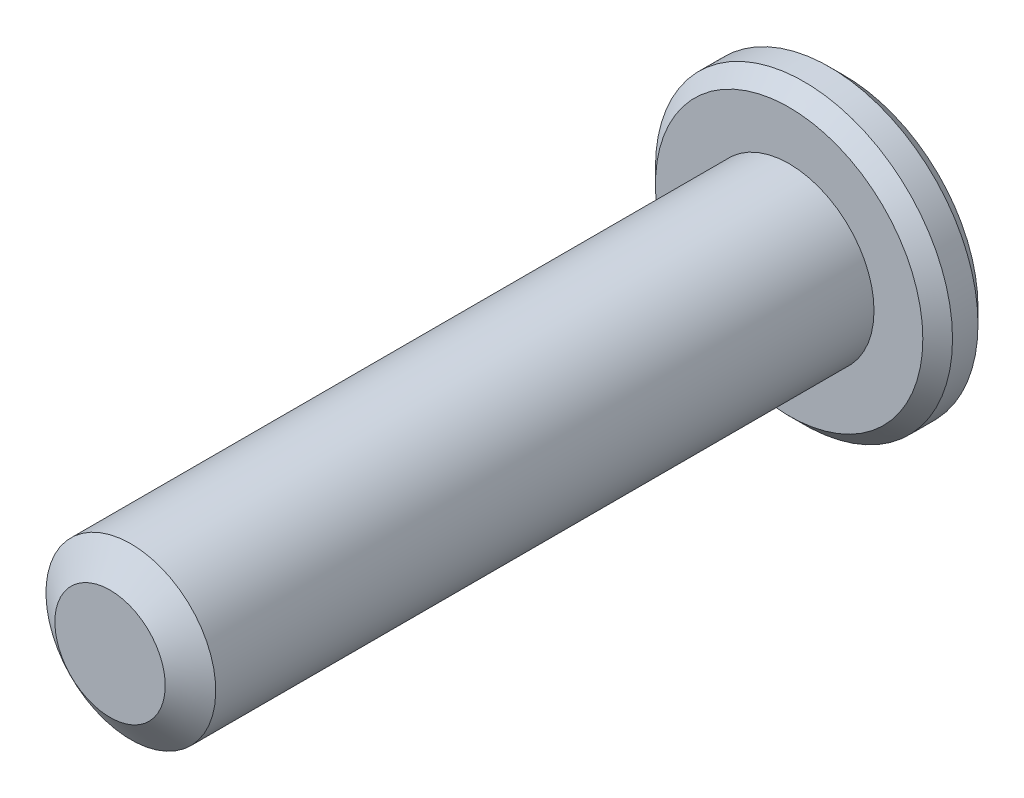
ISO-10303-21;
HEADER;
FILE_DESCRIPTION(('STEP AP214'),'2;1');
FILE_NAME('part.step','',(''),(''),'','','');
FILE_SCHEMA(('AUTOMOTIVE_DESIGN { 1 0 10303 214 1 1 1 1 }'));
ENDSEC;
DATA;
#1=APPLICATION_CONTEXT('core data for automotive mechanical design processes');
#2=APPLICATION_PROTOCOL_DEFINITION('international standard','automotive_design',2000,#1);
#3=PRODUCT_CONTEXT('',#1,'mechanical');
#4=PRODUCT('Part','Part','',(#3));
#5=PRODUCT_RELATED_PRODUCT_CATEGORY('part','',(#4));
#6=PRODUCT_DEFINITION_FORMATION('','',#4);
#7=PRODUCT_DEFINITION_CONTEXT('part definition',#1,'design');
#8=PRODUCT_DEFINITION('design','',#6,#7);
#9=PRODUCT_DEFINITION_SHAPE('','',#8);
#10=(LENGTH_UNIT() NAMED_UNIT(*) SI_UNIT(.MILLI.,.METRE.));
#11=(NAMED_UNIT(*) PLANE_ANGLE_UNIT() SI_UNIT($,.RADIAN.));
#12=(NAMED_UNIT(*) SI_UNIT($,.STERADIAN.) SOLID_ANGLE_UNIT());
#13=UNCERTAINTY_MEASURE_WITH_UNIT(LENGTH_MEASURE(1.E-05),#10,'distance_accuracy_value','');
#14=(GEOMETRIC_REPRESENTATION_CONTEXT(3) GLOBAL_UNCERTAINTY_ASSIGNED_CONTEXT((#13)) GLOBAL_UNIT_ASSIGNED_CONTEXT((#10,
#11,#12)) REPRESENTATION_CONTEXT('',''));
#15=CARTESIAN_POINT('',(0.,0.,0.));
#16=DIRECTION('',(0.,0.,1.));
#17=DIRECTION('',(1.,0.,0.));
#18=AXIS2_PLACEMENT_3D('',#15,#16,#17);
#19=CARTESIAN_POINT('',(0.,0.,0.));
#20=DIRECTION('',(0.,0.,1.));
#21=DIRECTION('',(1.,0.,0.));
#22=AXIS2_PLACEMENT_3D('',#19,#20,#21);
#23=PLANE('',#22);
#24=CARTESIAN_POINT('',(0.,0.,0.));
#25=DIRECTION('',(0.,0.,1.));
#26=DIRECTION('',(1.,0.,0.));
#27=AXIS2_PLACEMENT_3D('',#24,#25,#26);
#28=CIRCLE('',#27,3.15);
#29=CARTESIAN_POINT('',(3.15,0.,0.));
#30=VERTEX_POINT('',#29);
#31=EDGE_CURVE('E11',#30,#30,#28,.F.);
#32=ORIENTED_EDGE('',*,*,#31,.T.);
#33=EDGE_LOOP('',(#32));
#34=FACE_BOUND('',#33,.T.);
#35=CARTESIAN_POINT('',(0.,0.,0.));
#36=DIRECTION('',(0.,0.,1.));
#37=DIRECTION('',(1.,0.,0.));
#38=AXIS2_PLACEMENT_3D('',#35,#36,#37);
#39=CIRCLE('',#38,1.44337567297406);
#40=CARTESIAN_POINT('',(1.25,0.721687836487034,0.));
#41=VERTEX_POINT('',#40);
#42=CARTESIAN_POINT('',(0.,1.44337567297406,0.));
#43=VERTEX_POINT('',#42);
#44=EDGE_CURVE('E92',#41,#43,#39,.T.);
#45=ORIENTED_EDGE('',*,*,#44,.T.);
#46=CARTESIAN_POINT('',(0.,0.,0.));
#47=DIRECTION('',(0.,0.,1.));
#48=DIRECTION('',(1.,0.,0.));
#49=AXIS2_PLACEMENT_3D('',#46,#47,#48);
#50=CIRCLE('',#49,1.44337567297406);
#51=CARTESIAN_POINT('',(-1.25,0.721687836487029,0.));
#52=VERTEX_POINT('',#51);
#53=EDGE_CURVE('E103',#43,#52,#50,.T.);
#54=ORIENTED_EDGE('',*,*,#53,.T.);
#55=CARTESIAN_POINT('',(0.,0.,0.));
#56=DIRECTION('',(0.,0.,1.));
#57=DIRECTION('',(1.,0.,0.));
#58=AXIS2_PLACEMENT_3D('',#55,#56,#57);
#59=CIRCLE('',#58,1.44337567297406);
#60=CARTESIAN_POINT('',(-1.25,-0.721687836487031,0.));
#61=VERTEX_POINT('',#60);
#62=EDGE_CURVE('E121',#52,#61,#59,.T.);
#63=ORIENTED_EDGE('',*,*,#62,.T.);
#64=CARTESIAN_POINT('',(0.,0.,0.));
#65=DIRECTION('',(0.,0.,1.));
#66=DIRECTION('',(1.,0.,0.));
#67=AXIS2_PLACEMENT_3D('',#64,#65,#66);
#68=CIRCLE('',#67,1.44337567297406);
#69=CARTESIAN_POINT('',(0.,-1.44337567297406,0.));
#70=VERTEX_POINT('',#69);
#71=EDGE_CURVE('E256',#61,#70,#68,.T.);
#72=ORIENTED_EDGE('',*,*,#71,.T.);
#73=CARTESIAN_POINT('',(0.,0.,0.));
#74=DIRECTION('',(0.,0.,1.));
#75=DIRECTION('',(1.,0.,0.));
#76=AXIS2_PLACEMENT_3D('',#73,#74,#75);
#77=CIRCLE('',#76,1.44337567297406);
#78=CARTESIAN_POINT('',(1.25,-0.721687836487033,0.));
#79=VERTEX_POINT('',#78);
#80=EDGE_CURVE('E257',#70,#79,#77,.T.);
#81=ORIENTED_EDGE('',*,*,#80,.T.);
#82=CARTESIAN_POINT('',(0.,0.,0.));
#83=DIRECTION('',(0.,0.,1.));
#84=DIRECTION('',(1.,0.,0.));
#85=AXIS2_PLACEMENT_3D('',#82,#83,#84);
#86=CIRCLE('',#85,1.44337567297406);
#87=EDGE_CURVE('E106',#79,#41,#86,.T.);
#88=ORIENTED_EDGE('',*,*,#87,.T.);
#89=EDGE_LOOP('',(#45,#54,#63,#72,#81,#88));
#90=FACE_BOUND('',#89,.T.);
#91=ADVANCED_FACE('F34',(#34,#90),#23,.F.);
#92=CARTESIAN_POINT('',(1.25,0.721687836487033,0.975));
#93=DIRECTION('',(-0.5,-0.866025403784439,0.));
#94=DIRECTION('',(0.866025403784439,-0.5,0.));
#95=AXIS2_PLACEMENT_3D('',#92,#93,#94);
#96=PLANE('',#95);
#97=DIRECTION('',(0.,0.,-1.));
#98=VECTOR('',#97,1.);
#99=CARTESIAN_POINT('',(0.,1.44337567297406,0.975));
#100=LINE('',#99,#98);
#101=CARTESIAN_POINT('',(0.,1.44337567297406,0.975));
#102=VERTEX_POINT('',#101);
#103=EDGE_CURVE('E118',#102,#43,#100,.T.);
#104=ORIENTED_EDGE('',*,*,#103,.T.);
#105=CARTESIAN_POINT('',(1.2502,0.721572366433195,-0.000115483909135154));
#106=CARTESIAN_POINT('',(1.20722483292841,0.746384090710445,0.0246783319448971));
#107=CARTESIAN_POINT('',(1.16353099525405,0.771610739653665,0.0480162655813172));
#108=CARTESIAN_POINT('',(1.07443406915806,0.823050873919155,0.0907479959154641));
#109=CARTESIAN_POINT('',(1.02902250164293,0.849269254648334,0.110118007639587));
#110=CARTESIAN_POINT('',(0.937452179064738,0.902137405038636,0.143299516586524));
#111=CARTESIAN_POINT('',(0.891316759824113,0.928773701756387,0.157194440947345));
#112=CARTESIAN_POINT('',(0.798029919592406,0.982632884076013,0.178602717839362));
#113=CARTESIAN_POINT('',(0.750881350863619,1.00985412292348,0.186132058433214));
#114=CARTESIAN_POINT('',(0.669626443112746,1.05676666578643,0.192925501949298));
#115=CARTESIAN_POINT('',(0.635625123372058,1.07639733689152,0.193931440895651));
#116=CARTESIAN_POINT('',(0.567682235567521,1.11562418145499,0.192238585088682));
#117=CARTESIAN_POINT('',(0.533740682344341,1.1352203463451,0.189538972784462));
#118=CARTESIAN_POINT('',(0.466185143542499,1.1742235548576,0.180591069683623));
#119=CARTESIAN_POINT('',(0.432571492713224,1.19363040521233,0.174339474100295));
#120=CARTESIAN_POINT('',(0.365905361782186,1.23212011385119,0.158624318586096));
#121=CARTESIAN_POINT('',(0.332853128969703,1.2512028293628,0.149159379912542));
#122=CARTESIAN_POINT('',(0.248200308399734,1.30007715810653,0.121068609312414));
#123=CARTESIAN_POINT('',(0.19713350757036,1.32956058931202,0.1003298425478));
#124=CARTESIAN_POINT('',(0.0969991458867435,1.38737318998519,0.053612865328524));
#125=CARTESIAN_POINT('',(0.0479256884217289,1.41570576386268,0.0276517040532343));
#126=CARTESIAN_POINT('',(-0.000200000000001579,1.4434911430279,-0.000115483909135786));
#127=B_SPLINE_CURVE_WITH_KNOTS('',3,(#105,#106,#107,#108,#109,#110,#111,#112,#113,#114,#115,
#116,#117,#118,#119,#120,#121,#122,#123,#124,#125,#126),.UNSPECIFIED.,.F.,.F.,(4,2,2,2,2,2,2,2,
2,2,4),(0.,0.166533409618303,0.334037607289761,0.498880396489697,0.663307919240274,
0.780963963458826,0.898645970148452,1.01643764860773,1.13427993171549,1.32148652032141,
1.50809158792573),.UNSPECIFIED.);
#128=EDGE_CURVE('E89',#41,#43,#127,.T.);
#129=ORIENTED_EDGE('',*,*,#128,.F.);
#130=DIRECTION('',(0.,0.,-1.));
#131=VECTOR('',#130,1.);
#132=CARTESIAN_POINT('',(1.25,0.721687836487033,0.975));
#133=LINE('',#132,#131);
#134=CARTESIAN_POINT('',(1.25,0.721687836487033,0.975));
#135=VERTEX_POINT('',#134);
#136=EDGE_CURVE('E238',#135,#41,#133,.T.);
#137=ORIENTED_EDGE('',*,*,#136,.F.);
#138=DIRECTION('',(-0.866025403784439,0.499999999999999,0.));
#139=VECTOR('',#138,1.);
#140=CARTESIAN_POINT('',(1.25,0.721687836487033,0.975));
#141=LINE('',#140,#139);
#142=EDGE_CURVE('E113',#135,#102,#141,.T.);
#143=ORIENTED_EDGE('',*,*,#142,.T.);
#144=EDGE_LOOP('',(#104,#129,#137,#143));
#145=FACE_BOUND('',#144,.T.);
#146=ADVANCED_FACE('F124',(#145),#96,.T.);
#147=CARTESIAN_POINT('',(1.25,-0.72168783648703,0.975));
#148=DIRECTION('',(-1.,0.,0.));
#149=DIRECTION('',(0.,-1.,0.));
#150=AXIS2_PLACEMENT_3D('',#147,#148,#149);
#151=PLANE('',#150);
#152=ORIENTED_EDGE('',*,*,#136,.T.);
#153=CARTESIAN_POINT('',(1.25,-1.38992943348888,-0.425956782764809));
#154=CARTESIAN_POINT('',(1.25,-1.35585360144598,-0.400623845905462));
#155=CARTESIAN_POINT('',(1.25,-1.32158265708561,-0.375554038623504));
#156=CARTESIAN_POINT('',(1.25,-1.25257320054392,-0.326047772105517));
#157=CARTESIAN_POINT('',(1.25,-1.21783456799035,-0.301611480846757));
#158=CARTESIAN_POINT('',(1.25,-1.11229379200971,-0.229066172613867));
#159=CARTESIAN_POINT('',(1.25,-1.04068485708168,-0.182111039259463));
#160=CARTESIAN_POINT('',(1.25,-0.890834011639573,-0.090370816664351));
#161=CARTESIAN_POINT('',(1.25,-0.812441254075326,-0.0458291712301425));
#162=CARTESIAN_POINT('',(1.25,-0.651805951733887,0.0353370411272767));
#163=CARTESIAN_POINT('',(1.25,-0.569577514603351,0.071988205932038));
#164=CARTESIAN_POINT('',(1.25,-0.445666902783947,0.116811215274388));
#165=CARTESIAN_POINT('',(1.25,-0.405715906756983,0.129754356856506));
#166=CARTESIAN_POINT('',(1.25,-0.324892689132276,0.152426214590396));
#167=CARTESIAN_POINT('',(1.25,-0.284020400151318,0.162154694802131));
#168=CARTESIAN_POINT('',(1.25,-0.202258662465061,0.177742360186229));
#169=CARTESIAN_POINT('',(1.25,-0.161381483064384,0.183664926568388));
#170=CARTESIAN_POINT('',(1.25,-0.0792441307238302,0.191532978674059));
#171=CARTESIAN_POINT('',(1.25,-0.0379840154943749,0.193479054203921));
#172=CARTESIAN_POINT('',(1.25,0.043234160036465,0.193267103507984));
#173=CARTESIAN_POINT('',(1.25,0.0831926097530767,0.191235450956019));
#174=CARTESIAN_POINT('',(1.25,0.16274644611995,0.183447818944177));
#175=CARTESIAN_POINT('',(1.25,0.202341758544679,0.177691094556945));
#176=CARTESIAN_POINT('',(1.25,0.28154631912982,0.162661385825963));
#177=CARTESIAN_POINT('',(1.25,0.321144394728612,0.153330372505309));
#178=CARTESIAN_POINT('',(1.25,0.399480919290786,0.131632964761722));
#179=CARTESIAN_POINT('',(1.25,0.438219456017128,0.119266881803288));
#180=CARTESIAN_POINT('',(1.25,0.562551887219006,0.0749889167188917));
#181=CARTESIAN_POINT('',(1.25,0.646311872820088,0.0379381891982371));
#182=CARTESIAN_POINT('',(1.25,0.809873231963308,-0.0443641458390639));
#183=CARTESIAN_POINT('',(1.25,0.889658742138622,-0.089645710239019));
#184=CARTESIAN_POINT('',(1.25,1.04210036236046,-0.182982930104089));
#185=CARTESIAN_POINT('',(1.25,1.11491334005909,-0.230785501963126));
#186=CARTESIAN_POINT('',(1.25,1.22219009712169,-0.304648670049724));
#187=CARTESIAN_POINT('',(1.25,1.25748474843868,-0.329523500309345));
#188=CARTESIAN_POINT('',(1.25,1.32759376690005,-0.379921884715908));
#189=CARTESIAN_POINT('',(1.25,1.36240826213734,-0.405445260473571));
#190=CARTESIAN_POINT('',(1.25,1.3970231565127,-0.431237273698583));
#191=B_SPLINE_CURVE_WITH_KNOTS('',3,(#153,#154,#155,#156,#157,#158,#159,#160,#161,#162,#163,
#164,#165,#166,#167,#168,#169,#170,#171,#172,#173,#174,#175,#176,#177,#178,#179,#180,#181,#182,
#183,#184,#185,#186,#187,#188,#189,#190),.UNSPECIFIED.,.F.,.F.,(4,2,2,2,2,2,2,2,2,2,2,2,2,2,2,2,
2,2,4),(0.,0.127379033817002,0.254791503830238,0.51156114040546,0.781814668857772,
1.05114242314895,1.17702064742504,1.30290810848099,1.42664072359054,1.55035498493452,
1.67020252454504,1.7900740382739,1.91198034452075,2.03387414574237,2.30782771694623,
2.58279909340042,2.84397769429347,2.97351138093346,3.10300981562539),.UNSPECIFIED.);
#192=EDGE_CURVE('E96',#79,#41,#191,.T.);
#193=ORIENTED_EDGE('',*,*,#192,.F.);
#194=DIRECTION('',(0.,0.,-1.));
#195=VECTOR('',#194,1.);
#196=CARTESIAN_POINT('',(1.25,-0.72168783648703,0.975));
#197=LINE('',#196,#195);
#198=CARTESIAN_POINT('',(1.25,-0.72168783648703,0.975));
#199=VERTEX_POINT('',#198);
#200=EDGE_CURVE('E240',#199,#79,#197,.T.);
#201=ORIENTED_EDGE('',*,*,#200,.F.);
#202=DIRECTION('',(0.,1.,0.));
#203=VECTOR('',#202,1.);
#204=CARTESIAN_POINT('',(1.25,-0.72168783648703,0.975));
#205=LINE('',#204,#203);
#206=EDGE_CURVE('E49',#199,#135,#205,.T.);
#207=ORIENTED_EDGE('',*,*,#206,.T.);
#208=EDGE_LOOP('',(#152,#193,#201,#207));
#209=FACE_BOUND('',#208,.T.);
#210=ADVANCED_FACE('F185',(#209),#151,.T.);
#211=CARTESIAN_POINT('',(0.,-1.44337567297406,0.975));
#212=DIRECTION('',(-0.5,0.866025403784438,0.));
#213=DIRECTION('',(-0.866025403784438,-0.5,0.));
#214=AXIS2_PLACEMENT_3D('',#211,#212,#213);
#215=PLANE('',#214);
#216=ORIENTED_EDGE('',*,*,#200,.T.);
#217=CARTESIAN_POINT('',(-0.00019999999999945,-1.4434911430279,-0.000115483909134157));
#218=CARTESIAN_POINT('',(0.0427751670715872,-1.41867941875065,0.0246783319448981));
#219=CARTESIAN_POINT('',(0.0864690047459484,-1.39345276980743,0.0480162655813181));
#220=CARTESIAN_POINT('',(0.175565930841942,-1.34201263554194,0.090747995915465));
#221=CARTESIAN_POINT('',(0.220977498357064,-1.31579425481276,0.110118007639588));
#222=CARTESIAN_POINT('',(0.31254782093526,-1.26292610442246,0.143299516586525));
#223=CARTESIAN_POINT('',(0.358683240175886,-1.23628980770471,0.157194440947346));
#224=CARTESIAN_POINT('',(0.451970080407592,-1.18243062538508,0.178602717839363));
#225=CARTESIAN_POINT('',(0.499118649136379,-1.15520938653761,0.186132058433215));
#226=CARTESIAN_POINT('',(0.580373556887252,-1.10829684367467,0.192925501949299));
#227=CARTESIAN_POINT('',(0.61437487662794,-1.08866617256958,0.193931440895652));
#228=CARTESIAN_POINT('',(0.682317764432476,-1.04943932800611,0.192238585088683));
#229=CARTESIAN_POINT('',(0.716259317655656,-1.02984316311599,0.189538972784463));
#230=CARTESIAN_POINT('',(0.783814856457498,-0.990839954603497,0.180591069683624));
#231=CARTESIAN_POINT('',(0.817428507286774,-0.971433104248769,0.174339474100296));
#232=CARTESIAN_POINT('',(0.884094638217812,-0.932943395609904,0.158624318586098));
#233=CARTESIAN_POINT('',(0.917146871030294,-0.913860680098299,0.149159379912544));
#234=CARTESIAN_POINT('',(1.00179969160026,-0.864986351354566,0.121068609312416));
#235=CARTESIAN_POINT('',(1.05286649242964,-0.835502920149074,0.100329842547801));
#236=CARTESIAN_POINT('',(1.15300085411325,-0.777690319475906,0.0536128653285254));
#237=CARTESIAN_POINT('',(1.20207431157827,-0.749357745598415,0.0276517040532356));
#238=CARTESIAN_POINT('',(1.2502,-0.721572366433192,-0.00011548390913426));
#239=B_SPLINE_CURVE_WITH_KNOTS('',3,(#217,#218,#219,#220,#221,#222,#223,#224,#225,#226,#227,
#228,#229,#230,#231,#232,#233,#234,#235,#236,#237,#238),.UNSPECIFIED.,.F.,.F.,(4,2,2,2,2,2,2,2,
2,2,4),(0.,0.166533409618303,0.334037607289761,0.498880396489697,0.663307919240273,
0.780963963458825,0.898645970148451,1.01643764860773,1.13427993171549,1.32148652032141,
1.50809158792573),.UNSPECIFIED.);
#240=EDGE_CURVE('E294',#70,#79,#239,.T.);
#241=ORIENTED_EDGE('',*,*,#240,.F.);
#242=DIRECTION('',(0.,0.,-1.));
#243=VECTOR('',#242,1.);
#244=CARTESIAN_POINT('',(0.,-1.44337567297406,0.975));
#245=LINE('',#244,#243);
#246=CARTESIAN_POINT('',(0.,-1.44337567297406,0.975));
#247=VERTEX_POINT('',#246);
#248=EDGE_CURVE('E242',#247,#70,#245,.T.);
#249=ORIENTED_EDGE('',*,*,#248,.F.);
#250=DIRECTION('',(0.866025403784438,0.5,0.));
#251=VECTOR('',#250,1.);
#252=CARTESIAN_POINT('',(0.,-1.44337567297406,0.975));
#253=LINE('',#252,#251);
#254=EDGE_CURVE('E57',#247,#199,#253,.T.);
#255=ORIENTED_EDGE('',*,*,#254,.T.);
#256=EDGE_LOOP('',(#216,#241,#249,#255));
#257=FACE_BOUND('',#256,.T.);
#258=ADVANCED_FACE('F210',(#257),#215,.T.);
#259=CARTESIAN_POINT('',(-1.25,-0.72168783648703,0.975));
#260=DIRECTION('',(0.499999999999999,0.866025403784439,0.));
#261=DIRECTION('',(-0.866025403784439,0.5,0.));
#262=AXIS2_PLACEMENT_3D('',#259,#260,#261);
#263=PLANE('',#262);
#264=ORIENTED_EDGE('',*,*,#248,.T.);
#265=CARTESIAN_POINT('',(-1.2502,-0.721572366433193,-0.000115483909136238));
#266=CARTESIAN_POINT('',(-1.20722483292841,-0.746384090710442,0.0246783319448964));
#267=CARTESIAN_POINT('',(-1.16353099525405,-0.771610739653662,0.0480162655813167));
#268=CARTESIAN_POINT('',(-1.07443406915806,-0.823050873919153,0.0907479959154638));
#269=CARTESIAN_POINT('',(-1.02902250164294,-0.849269254648332,0.110118007639587));
#270=CARTESIAN_POINT('',(-0.93745217906474,-0.902137405038634,0.143299516586524));
#271=CARTESIAN_POINT('',(-0.891316759824114,-0.928773701756385,0.157194440947345));
#272=CARTESIAN_POINT('',(-0.798029919592407,-0.982632884076011,0.178602717839362));
#273=CARTESIAN_POINT('',(-0.75088135086362,-1.00985412292348,0.186132058433214));
#274=CARTESIAN_POINT('',(-0.669626443112747,-1.05676666578643,0.192925501949298));
#275=CARTESIAN_POINT('',(-0.635625123372058,-1.07639733689152,0.193931440895651));
#276=CARTESIAN_POINT('',(-0.567682235567522,-1.11562418145499,0.192238585088683));
#277=CARTESIAN_POINT('',(-0.533740682344342,-1.1352203463451,0.189538972784463));
#278=CARTESIAN_POINT('',(-0.4661851435425,-1.1742235548576,0.180591069683624));
#279=CARTESIAN_POINT('',(-0.432571492713225,-1.19363040521232,0.174339474100296));
#280=CARTESIAN_POINT('',(-0.365905361782187,-1.23212011385119,0.158624318586097));
#281=CARTESIAN_POINT('',(-0.332853128969704,-1.25120282936279,0.149159379912543));
#282=CARTESIAN_POINT('',(-0.248200308399735,-1.30007715810653,0.121068609312416));
#283=CARTESIAN_POINT('',(-0.197133507570361,-1.32956058931202,0.100329842547801));
#284=CARTESIAN_POINT('',(-0.0969991458867447,-1.38737318998519,0.0536128653285252));
#285=CARTESIAN_POINT('',(-0.04792568842173,-1.41570576386268,0.0276517040532354));
#286=CARTESIAN_POINT('',(0.000200000000000551,-1.4434911430279,-0.000115483909134179));
#287=B_SPLINE_CURVE_WITH_KNOTS('',3,(#265,#266,#267,#268,#269,#270,#271,#272,#273,#274,#275,
#276,#277,#278,#279,#280,#281,#282,#283,#284,#285,#286),.UNSPECIFIED.,.F.,.F.,(4,2,2,2,2,2,2,2,
2,2,4),(0.,0.166533409618304,0.334037607289763,0.498880396489699,0.663307919240276,
0.780963963458828,0.898645970148454,1.01643764860773,1.1342799317155,1.32148652032141,
1.50809158792574),.UNSPECIFIED.);
#288=EDGE_CURVE('E253',#61,#70,#287,.T.);
#289=ORIENTED_EDGE('',*,*,#288,.F.);
#290=DIRECTION('',(0.,0.,-1.));
#291=VECTOR('',#290,1.);
#292=CARTESIAN_POINT('',(-1.25,-0.72168783648703,0.975));
#293=LINE('',#292,#291);
#294=CARTESIAN_POINT('',(-1.25,-0.72168783648703,0.975));
#295=VERTEX_POINT('',#294);
#296=EDGE_CURVE('E131',#295,#61,#293,.T.);
#297=ORIENTED_EDGE('',*,*,#296,.F.);
#298=DIRECTION('',(0.866025403784439,-0.499999999999999,0.));
#299=VECTOR('',#298,1.);
#300=CARTESIAN_POINT('',(-1.25,-0.72168783648703,0.975));
#301=LINE('',#300,#299);
#302=EDGE_CURVE('E234',#295,#247,#301,.T.);
#303=ORIENTED_EDGE('',*,*,#302,.T.);
#304=EDGE_LOOP('',(#264,#289,#297,#303));
#305=FACE_BOUND('',#304,.T.);
#306=ADVANCED_FACE('F206',(#305),#263,.T.);
#307=CARTESIAN_POINT('',(-1.25,0.721687836487031,0.975));
#308=DIRECTION('',(1.,0.,0.));
#309=DIRECTION('',(0.,1.,0.));
#310=AXIS2_PLACEMENT_3D('',#307,#308,#309);
#311=PLANE('',#310);
#312=ORIENTED_EDGE('',*,*,#296,.T.);
#313=CARTESIAN_POINT('',(-1.25,-1.38992943348888,-0.425956782764809));
#314=CARTESIAN_POINT('',(-1.25,-1.35585360144598,-0.400623845905462));
#315=CARTESIAN_POINT('',(-1.25,-1.32158265708561,-0.375554038623504));
#316=CARTESIAN_POINT('',(-1.25,-1.25257320054391,-0.326047772105518));
#317=CARTESIAN_POINT('',(-1.25,-1.21783456799035,-0.301611480846757));
#318=CARTESIAN_POINT('',(-1.25,-1.11229379200971,-0.229066172613867));
#319=CARTESIAN_POINT('',(-1.25,-1.04068485708168,-0.182111039259464));
#320=CARTESIAN_POINT('',(-1.25,-0.890834011639573,-0.090370816664352));
#321=CARTESIAN_POINT('',(-1.25,-0.812441254075325,-0.0458291712301438));
#322=CARTESIAN_POINT('',(-1.25,-0.651805951733886,0.035337041127275));
#323=CARTESIAN_POINT('',(-1.25,-0.569577514603351,0.0719882059320362));
#324=CARTESIAN_POINT('',(-1.25,-0.445666902783947,0.116811215274386));
#325=CARTESIAN_POINT('',(-1.25,-0.405715906756983,0.129754356856504));
#326=CARTESIAN_POINT('',(-1.25,-0.324892689132276,0.152426214590394));
#327=CARTESIAN_POINT('',(-1.25,-0.284020400151317,0.162154694802129));
#328=CARTESIAN_POINT('',(-1.25,-0.202258662465061,0.177742360186227));
#329=CARTESIAN_POINT('',(-1.25,-0.161381483064383,0.183664926568385));
#330=CARTESIAN_POINT('',(-1.25,-0.0792441307238298,0.191532978674057));
#331=CARTESIAN_POINT('',(-1.25,-0.0379840154943745,0.193479054203919));
#332=CARTESIAN_POINT('',(-1.25,0.0432341600364654,0.193267103507982));
#333=CARTESIAN_POINT('',(-1.25,0.0831926097530771,0.191235450956016));
#334=CARTESIAN_POINT('',(-1.25,0.162746446119951,0.183447818944174));
#335=CARTESIAN_POINT('',(-1.25,0.20234175854468,0.177691094556942));
#336=CARTESIAN_POINT('',(-1.25,0.28154631912982,0.162661385825961));
#337=CARTESIAN_POINT('',(-1.25,0.321144394728612,0.153330372505306));
#338=CARTESIAN_POINT('',(-1.25,0.399480919290787,0.131632964761719));
#339=CARTESIAN_POINT('',(-1.25,0.438219456017129,0.119266881803285));
#340=CARTESIAN_POINT('',(-1.25,0.562551887219006,0.074988916718889));
#341=CARTESIAN_POINT('',(-1.25,0.646311872820089,0.037938189198234));
#342=CARTESIAN_POINT('',(-1.25,0.809873231963309,-0.0443641458390674));
#343=CARTESIAN_POINT('',(-1.25,0.889658742138624,-0.0896457102390228));
#344=CARTESIAN_POINT('',(-1.25,1.04210036236046,-0.182982930104093));
#345=CARTESIAN_POINT('',(-1.25,1.11491334005909,-0.23078550196313));
#346=CARTESIAN_POINT('',(-1.25,1.2221900971217,-0.304648670049729));
#347=CARTESIAN_POINT('',(-1.25,1.25748474843869,-0.32952350030935));
#348=CARTESIAN_POINT('',(-1.25,1.32759376690005,-0.379921884715913));
#349=CARTESIAN_POINT('',(-1.25,1.36240826213735,-0.405445260473576));
#350=CARTESIAN_POINT('',(-1.25,1.39702315651271,-0.431237273698588));
#351=B_SPLINE_CURVE_WITH_KNOTS('',3,(#313,#314,#315,#316,#317,#318,#319,#320,#321,#322,#323,
#324,#325,#326,#327,#328,#329,#330,#331,#332,#333,#334,#335,#336,#337,#338,#339,#340,#341,#342,
#343,#344,#345,#346,#347,#348,#349,#350),.UNSPECIFIED.,.F.,.F.,(4,2,2,2,2,2,2,2,2,2,2,2,2,2,2,2,
2,2,4),(0.,0.127379033817001,0.254791503830238,0.51156114040546,0.781814668857771,
1.05114242314894,1.17702064742503,1.30290810848098,1.42664072359054,1.55035498493452,
1.67020252454504,1.7900740382739,1.91198034452075,2.03387414574236,2.30782771694623,
2.58279909340042,2.84397769429347,2.97351138093346,3.10300981562539),.UNSPECIFIED.);
#352=EDGE_CURVE('E248',#52,#61,#351,.F.);
#353=ORIENTED_EDGE('',*,*,#352,.F.);
#354=DIRECTION('',(0.,0.,-1.));
#355=VECTOR('',#354,1.);
#356=CARTESIAN_POINT('',(-1.25,0.721687836487031,0.975));
#357=LINE('',#356,#355);
#358=CARTESIAN_POINT('',(-1.25,0.721687836487031,0.975));
#359=VERTEX_POINT('',#358);
#360=EDGE_CURVE('E120',#359,#52,#357,.T.);
#361=ORIENTED_EDGE('',*,*,#360,.F.);
#362=DIRECTION('',(0.,-1.,0.));
#363=VECTOR('',#362,1.);
#364=CARTESIAN_POINT('',(-1.25,0.721687836487031,0.975));
#365=LINE('',#364,#363);
#366=EDGE_CURVE('E232',#359,#295,#365,.T.);
#367=ORIENTED_EDGE('',*,*,#366,.T.);
#368=EDGE_LOOP('',(#312,#353,#361,#367));
#369=FACE_BOUND('',#368,.T.);
#370=ADVANCED_FACE('F203',(#369),#311,.T.);
#371=CARTESIAN_POINT('',(0.,1.44337567297406,0.975));
#372=DIRECTION('',(0.5,-0.866025403784438,0.));
#373=DIRECTION('',(0.866025403784438,0.5,0.));
#374=AXIS2_PLACEMENT_3D('',#371,#372,#373);
#375=PLANE('',#374);
#376=ORIENTED_EDGE('',*,*,#360,.T.);
#377=CARTESIAN_POINT('',(0.000199999999998251,1.4434911430279,-0.000115483909135892));
#378=CARTESIAN_POINT('',(-0.0427751670715882,1.41867941875065,0.0246783319448963));
#379=CARTESIAN_POINT('',(-0.0864690047459495,1.39345276980743,0.0480162655813164));
#380=CARTESIAN_POINT('',(-0.175565930841943,1.34201263554194,0.0907479959154631));
#381=CARTESIAN_POINT('',(-0.220977498357065,1.31579425481276,0.110118007639586));
#382=CARTESIAN_POINT('',(-0.312547820935261,1.26292610442246,0.143299516586523));
#383=CARTESIAN_POINT('',(-0.358683240175886,1.23628980770471,0.157194440947344));
#384=CARTESIAN_POINT('',(-0.451970080407593,1.18243062538508,0.178602717839361));
#385=CARTESIAN_POINT('',(-0.49911864913638,1.15520938653761,0.186132058433213));
#386=CARTESIAN_POINT('',(-0.580373556887253,1.10829684367467,0.192925501949297));
#387=CARTESIAN_POINT('',(-0.614374876627941,1.08866617256958,0.19393144089565));
#388=CARTESIAN_POINT('',(-0.682317764432478,1.04943932800611,0.192238585088681));
#389=CARTESIAN_POINT('',(-0.716259317655658,1.02984316311599,0.189538972784461));
#390=CARTESIAN_POINT('',(-0.7838148564575,0.990839954603499,0.180591069683622));
#391=CARTESIAN_POINT('',(-0.817428507286775,0.971433104248771,0.174339474100294));
#392=CARTESIAN_POINT('',(-0.884094638217813,0.932943395609905,0.158624318586096));
#393=CARTESIAN_POINT('',(-0.917146871030295,0.9138606800983,0.149159379912541));
#394=CARTESIAN_POINT('',(-1.00179969160026,0.864986351354568,0.121068609312414));
#395=CARTESIAN_POINT('',(-1.05286649242964,0.835502920149076,0.100329842547799));
#396=CARTESIAN_POINT('',(-1.15300085411326,0.777690319475908,0.0536128653285229));
#397=CARTESIAN_POINT('',(-1.20207431157827,0.749357745598416,0.0276517040532329));
#398=CARTESIAN_POINT('',(-1.2502,0.721572366433193,-0.000115483909136993));
#399=B_SPLINE_CURVE_WITH_KNOTS('',3,(#377,#378,#379,#380,#381,#382,#383,#384,#385,#386,#387,
#388,#389,#390,#391,#392,#393,#394,#395,#396,#397,#398),.UNSPECIFIED.,.F.,.F.,(4,2,2,2,2,2,2,2,
2,2,4),(0.,0.166533409618303,0.334037607289761,0.498880396489697,0.663307919240272,
0.780963963458825,0.898645970148451,1.01643764860773,1.13427993171549,1.32148652032141,
1.50809158792573),.UNSPECIFIED.);
#400=EDGE_CURVE('E112',#43,#52,#399,.T.);
#401=ORIENTED_EDGE('',*,*,#400,.F.);
#402=ORIENTED_EDGE('',*,*,#103,.F.);
#403=DIRECTION('',(-0.866025403784438,-0.5,0.));
#404=VECTOR('',#403,1.);
#405=CARTESIAN_POINT('',(0.,1.44337567297406,0.975));
#406=LINE('',#405,#404);
#407=EDGE_CURVE('E230',#102,#359,#406,.T.);
#408=ORIENTED_EDGE('',*,*,#407,.T.);
#409=EDGE_LOOP('',(#376,#401,#402,#408));
#410=FACE_BOUND('',#409,.T.);
#411=ADVANCED_FACE('F117',(#410),#375,.T.);
#412=CARTESIAN_POINT('',(0.,0.,17.3));
#413=DIRECTION('',(0.,0.,-1.));
#414=DIRECTION('',(-1.,0.,0.));
#415=AXIS2_PLACEMENT_3D('',#412,#413,#414);
#416=CYLINDRICAL_SURFACE('',#415,2.);
#417=CARTESIAN_POINT('',(0.,0.,1.3));
#418=DIRECTION('',(0.,0.,1.));
#419=DIRECTION('',(1.,0.,0.));
#420=AXIS2_PLACEMENT_3D('',#417,#418,#419);
#421=CIRCLE('',#420,2.);
#422=CARTESIAN_POINT('',(2.,0.,1.3));
#423=VERTEX_POINT('',#422);
#424=EDGE_CURVE('E126',#423,#423,#421,.T.);
#425=ORIENTED_EDGE('',*,*,#424,.T.);
#426=EDGE_LOOP('',(#425));
#427=FACE_BOUND('',#426,.T.);
#428=CARTESIAN_POINT('',(0.,0.,16.8098547232532));
#429=DIRECTION('',(0.,0.,-1.));
#430=DIRECTION('',(0.,1.,0.));
#431=AXIS2_PLACEMENT_3D('',#428,#429,#430);
#432=CIRCLE('',#431,2.);
#433=CARTESIAN_POINT('',(0.,2.,16.8098547232532));
#434=VERTEX_POINT('',#433);
#435=EDGE_CURVE('E137',#434,#434,#432,.T.);
#436=ORIENTED_EDGE('',*,*,#435,.T.);
#437=EDGE_LOOP('',(#436));
#438=FACE_BOUND('',#437,.T.);
#439=ADVANCED_FACE('F163',(#427,#438),#416,.T.);
#440=CARTESIAN_POINT('',(0.,0.,17.3));
#441=DIRECTION('',(0.,0.,-1.));
#442=DIRECTION('',(0.,1.,0.));
#443=AXIS2_PLACEMENT_3D('',#440,#441,#442);
#444=CONICAL_SURFACE('',#443,1.3,0.959931088596885);
#445=ORIENTED_EDGE('',*,*,#435,.F.);
#446=EDGE_LOOP('',(#445));
#447=FACE_BOUND('',#446,.T.);
#448=CARTESIAN_POINT('',(0.,0.,17.3));
#449=DIRECTION('',(0.,0.,-1.));
#450=DIRECTION('',(0.,1.,0.));
#451=AXIS2_PLACEMENT_3D('',#448,#449,#450);
#452=CIRCLE('',#451,1.3);
#453=CARTESIAN_POINT('',(0.,1.3,17.3));
#454=VERTEX_POINT('',#453);
#455=EDGE_CURVE('E129',#454,#454,#452,.T.);
#456=ORIENTED_EDGE('',*,*,#455,.T.);
#457=EDGE_LOOP('',(#456));
#458=FACE_BOUND('',#457,.T.);
#459=ADVANCED_FACE('F166',(#447,#458),#444,.T.);
#460=CARTESIAN_POINT('',(0.,0.,17.3));
#461=DIRECTION('',(0.,0.,1.));
#462=DIRECTION('',(1.,0.,0.));
#463=AXIS2_PLACEMENT_3D('',#460,#461,#462);
#464=PLANE('',#463);
#465=ORIENTED_EDGE('',*,*,#455,.F.);
#466=EDGE_LOOP('',(#465));
#467=FACE_BOUND('',#466,.T.);
#468=ADVANCED_FACE('F159',(#467),#464,.T.);
#469=CARTESIAN_POINT('',(0.,0.,1.3));
#470=DIRECTION('',(0.,0.,1.));
#471=DIRECTION('',(1.,0.,0.));
#472=AXIS2_PLACEMENT_3D('',#469,#470,#471);
#473=PLANE('',#472);
#474=CARTESIAN_POINT('',(0.,0.,1.3));
#475=DIRECTION('',(0.,0.,1.));
#476=DIRECTION('',(1.,0.,0.));
#477=AXIS2_PLACEMENT_3D('',#474,#475,#476);
#478=CIRCLE('',#477,3.15);
#479=CARTESIAN_POINT('',(3.15,0.,1.3));
#480=VERTEX_POINT('',#479);
#481=EDGE_CURVE('E139',#480,#480,#478,.T.);
#482=ORIENTED_EDGE('',*,*,#481,.T.);
#483=EDGE_LOOP('',(#482));
#484=FACE_BOUND('',#483,.T.);
#485=ORIENTED_EDGE('',*,*,#424,.F.);
#486=EDGE_LOOP('',(#485));
#487=FACE_BOUND('',#486,.T.);
#488=ADVANCED_FACE('F156',(#484,#487),#473,.T.);
#489=CARTESIAN_POINT('',(0.,0.,1.3));
#490=DIRECTION('',(0.,0.,-1.));
#491=DIRECTION('',(-1.,0.,0.));
#492=AXIS2_PLACEMENT_3D('',#489,#490,#491);
#493=CYLINDRICAL_SURFACE('',#492,3.5);
#494=CARTESIAN_POINT('',(0.,0.,0.949999999999996));
#495=DIRECTION('',(0.,0.,1.));
#496=DIRECTION('',(1.,0.,0.));
#497=AXIS2_PLACEMENT_3D('',#494,#495,#496);
#498=CIRCLE('',#497,3.5);
#499=CARTESIAN_POINT('',(3.5,0.,0.949999999999996));
#500=VERTEX_POINT('',#499);
#501=EDGE_CURVE('E42',#500,#500,#498,.F.);
#502=ORIENTED_EDGE('',*,*,#501,.T.);
#503=EDGE_LOOP('',(#502));
#504=FACE_BOUND('',#503,.T.);
#505=CARTESIAN_POINT('',(0.,0.,0.349999999999995));
#506=DIRECTION('',(0.,0.,1.));
#507=DIRECTION('',(1.,0.,0.));
#508=AXIS2_PLACEMENT_3D('',#505,#506,#507);
#509=CIRCLE('',#508,3.5);
#510=CARTESIAN_POINT('',(3.5,0.,0.349999999999995));
#511=VERTEX_POINT('',#510);
#512=EDGE_CURVE('E143',#511,#511,#509,.T.);
#513=ORIENTED_EDGE('',*,*,#512,.T.);
#514=EDGE_LOOP('',(#513));
#515=FACE_BOUND('',#514,.T.);
#516=ADVANCED_FACE('F148',(#504,#515),#493,.T.);
#517=CARTESIAN_POINT('',(1.25,0.721687836487033,0.975));
#518=DIRECTION('',(0.,0.,-1.));
#519=DIRECTION('',(-1.,0.,0.));
#520=AXIS2_PLACEMENT_3D('',#517,#518,#519);
#521=PLANE('',#520);
#522=ORIENTED_EDGE('',*,*,#142,.F.);
#523=ORIENTED_EDGE('',*,*,#206,.F.);
#524=ORIENTED_EDGE('',*,*,#254,.F.);
#525=ORIENTED_EDGE('',*,*,#302,.F.);
#526=ORIENTED_EDGE('',*,*,#366,.F.);
#527=ORIENTED_EDGE('',*,*,#407,.F.);
#528=EDGE_LOOP('',(#522,#523,#524,#525,#526,#527));
#529=FACE_BOUND('',#528,.T.);
#530=ADVANCED_FACE('F193',(#529),#521,.T.);
#531=CARTESIAN_POINT('',(0.,0.,0.));
#532=DIRECTION('',(0.,0.,-1.));
#533=DIRECTION('',(1.,0.,0.));
#534=AXIS2_PLACEMENT_3D('',#531,#532,#533);
#535=CONICAL_SURFACE('',#534,1.44337567297406,0.78539816339745);
#536=ORIENTED_EDGE('',*,*,#400,.T.);
#537=ORIENTED_EDGE('',*,*,#53,.F.);
#538=EDGE_LOOP('',(#536,#537));
#539=FACE_BOUND('',#538,.T.);
#540=ADVANCED_FACE('F111',(#539),#535,.F.);
#541=CARTESIAN_POINT('',(0.,0.,0.));
#542=DIRECTION('',(0.,0.,-1.));
#543=DIRECTION('',(1.,0.,0.));
#544=AXIS2_PLACEMENT_3D('',#541,#542,#543);
#545=CONICAL_SURFACE('',#544,1.44337567297406,0.78539816339745);
#546=ORIENTED_EDGE('',*,*,#352,.T.);
#547=ORIENTED_EDGE('',*,*,#62,.F.);
#548=EDGE_LOOP('',(#546,#547));
#549=FACE_BOUND('',#548,.T.);
#550=ADVANCED_FACE('F219',(#549),#545,.F.);
#551=CARTESIAN_POINT('',(0.,0.,0.));
#552=DIRECTION('',(0.,0.,-1.));
#553=DIRECTION('',(1.,0.,0.));
#554=AXIS2_PLACEMENT_3D('',#551,#552,#553);
#555=CONICAL_SURFACE('',#554,1.44337567297406,0.78539816339745);
#556=ORIENTED_EDGE('',*,*,#288,.T.);
#557=ORIENTED_EDGE('',*,*,#71,.F.);
#558=EDGE_LOOP('',(#556,#557));
#559=FACE_BOUND('',#558,.T.);
#560=ADVANCED_FACE('F276',(#559),#555,.F.);
#561=CARTESIAN_POINT('',(0.,0.,0.));
#562=DIRECTION('',(0.,0.,-1.));
#563=DIRECTION('',(1.,0.,0.));
#564=AXIS2_PLACEMENT_3D('',#561,#562,#563);
#565=CONICAL_SURFACE('',#564,1.44337567297406,0.78539816339745);
#566=ORIENTED_EDGE('',*,*,#240,.T.);
#567=ORIENTED_EDGE('',*,*,#80,.F.);
#568=EDGE_LOOP('',(#566,#567));
#569=FACE_BOUND('',#568,.T.);
#570=ADVANCED_FACE('F280',(#569),#565,.F.);
#571=CARTESIAN_POINT('',(0.,0.,0.));
#572=DIRECTION('',(0.,0.,-1.));
#573=DIRECTION('',(1.,0.,0.));
#574=AXIS2_PLACEMENT_3D('',#571,#572,#573);
#575=CONICAL_SURFACE('',#574,1.44337567297406,0.78539816339745);
#576=ORIENTED_EDGE('',*,*,#192,.T.);
#577=ORIENTED_EDGE('',*,*,#87,.F.);
#578=EDGE_LOOP('',(#576,#577));
#579=FACE_BOUND('',#578,.T.);
#580=ADVANCED_FACE('F284',(#579),#575,.F.);
#581=CARTESIAN_POINT('',(0.,0.,0.));
#582=DIRECTION('',(0.,0.,-1.));
#583=DIRECTION('',(1.,0.,0.));
#584=AXIS2_PLACEMENT_3D('',#581,#582,#583);
#585=CONICAL_SURFACE('',#584,1.44337567297406,0.78539816339745);
#586=ORIENTED_EDGE('',*,*,#128,.T.);
#587=ORIENTED_EDGE('',*,*,#44,.F.);
#588=EDGE_LOOP('',(#586,#587));
#589=FACE_BOUND('',#588,.T.);
#590=ADVANCED_FACE('F91',(#589),#585,.F.);
#591=CARTESIAN_POINT('',(0.,0.,1.3));
#592=DIRECTION('',(0.,0.,-1.));
#593=DIRECTION('',(-1.,0.,0.));
#594=AXIS2_PLACEMENT_3D('',#591,#592,#593);
#595=CONICAL_SURFACE('',#594,3.15,0.785398163397446);
#596=ORIENTED_EDGE('',*,*,#501,.F.);
#597=EDGE_LOOP('',(#596));
#598=FACE_BOUND('',#597,.T.);
#599=ORIENTED_EDGE('',*,*,#481,.F.);
#600=EDGE_LOOP('',(#599));
#601=FACE_BOUND('',#600,.T.);
#602=ADVANCED_FACE('F151',(#598,#601),#595,.T.);
#603=CARTESIAN_POINT('',(0.,0.,0.349999999999995));
#604=DIRECTION('',(0.,0.,1.));
#605=DIRECTION('',(1.,0.,0.));
#606=AXIS2_PLACEMENT_3D('',#603,#604,#605);
#607=CONICAL_SURFACE('',#606,3.5,0.785398163397451);
#608=ORIENTED_EDGE('',*,*,#31,.F.);
#609=EDGE_LOOP('',(#608));
#610=FACE_BOUND('',#609,.T.);
#611=ORIENTED_EDGE('',*,*,#512,.F.);
#612=EDGE_LOOP('',(#611));
#613=FACE_BOUND('',#612,.T.);
#614=ADVANCED_FACE('F36',(#610,#613),#607,.T.);
#615=CLOSED_SHELL('',(#91,#146,#210,#258,#306,#370,#411,#439,#459,#468,#488,#516,#530,#540,#550,
#560,#570,#580,#590,#602,#614));
#616=MANIFOLD_SOLID_BREP('B2',#615);
#617=ADVANCED_BREP_SHAPE_REPRESENTATION('',(#18,#616),#14);
#618=SHAPE_DEFINITION_REPRESENTATION(#9,#617);
ENDSEC;
END-ISO-10303-21;
